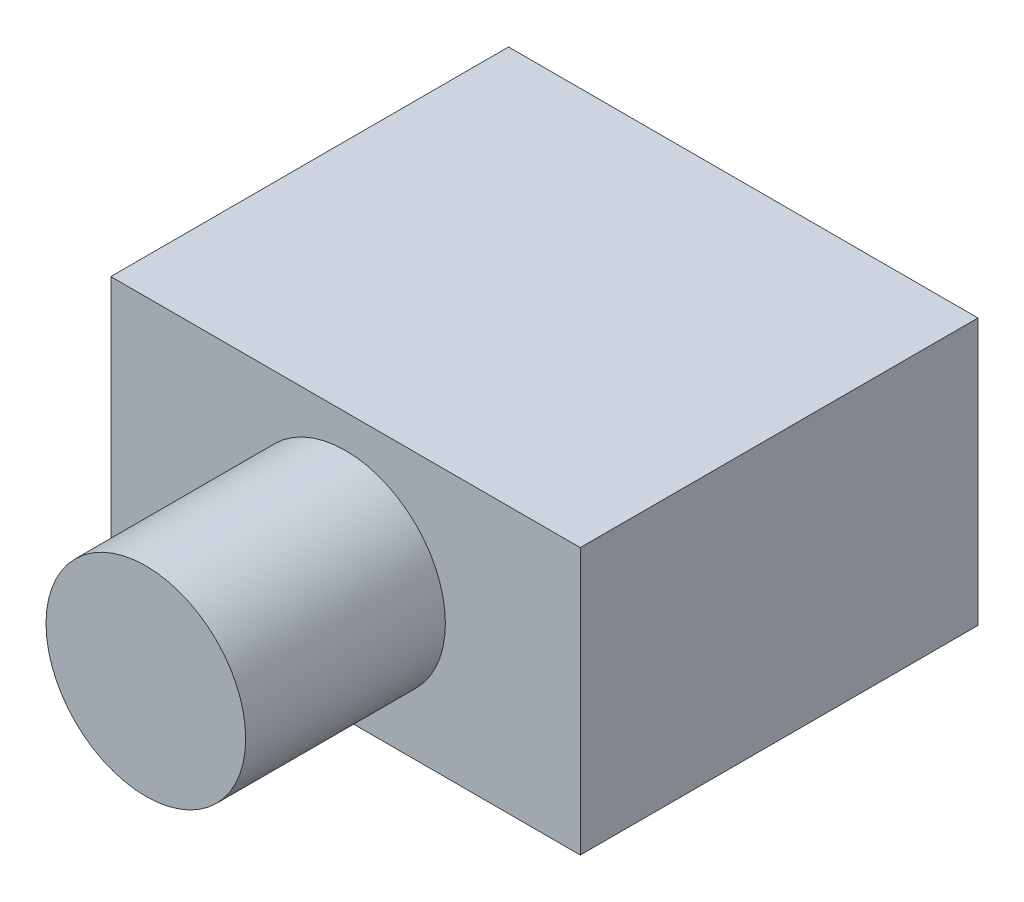
ISO-10303-21;
HEADER;
FILE_DESCRIPTION(('STEP AP214'),'2;1');
FILE_NAME('part.step','',(''),(''),'','','');
FILE_SCHEMA(('AUTOMOTIVE_DESIGN { 1 0 10303 214 1 1 1 1 }'));
ENDSEC;
DATA;
#1=APPLICATION_CONTEXT('core data for automotive mechanical design processes');
#2=APPLICATION_PROTOCOL_DEFINITION('international standard','automotive_design',2000,#1);
#3=PRODUCT_CONTEXT('',#1,'mechanical');
#4=PRODUCT('Part','Part','',(#3));
#5=PRODUCT_RELATED_PRODUCT_CATEGORY('part','',(#4));
#6=PRODUCT_DEFINITION_FORMATION('','',#4);
#7=PRODUCT_DEFINITION_CONTEXT('part definition',#1,'design');
#8=PRODUCT_DEFINITION('design','',#6,#7);
#9=PRODUCT_DEFINITION_SHAPE('','',#8);
#10=(LENGTH_UNIT() NAMED_UNIT(*) SI_UNIT(.MILLI.,.METRE.));
#11=(NAMED_UNIT(*) PLANE_ANGLE_UNIT() SI_UNIT($,.RADIAN.));
#12=(NAMED_UNIT(*) SI_UNIT($,.STERADIAN.) SOLID_ANGLE_UNIT());
#13=UNCERTAINTY_MEASURE_WITH_UNIT(LENGTH_MEASURE(1.E-05),#10,'distance_accuracy_value','');
#14=(GEOMETRIC_REPRESENTATION_CONTEXT(3) GLOBAL_UNCERTAINTY_ASSIGNED_CONTEXT((#13)) GLOBAL_UNIT_ASSIGNED_CONTEXT((#10,
#11,#12)) REPRESENTATION_CONTEXT('',''));
#15=CARTESIAN_POINT('',(0.,0.,0.));
#16=DIRECTION('',(0.,0.,1.));
#17=DIRECTION('',(1.,0.,0.));
#18=AXIS2_PLACEMENT_3D('',#15,#16,#17);
#19=CARTESIAN_POINT('',(14.105,-8.,23.9));
#20=DIRECTION('',(-1.,0.,0.));
#21=DIRECTION('',(0.,0.,1.));
#22=AXIS2_PLACEMENT_3D('',#19,#20,#21);
#23=PLANE('',#22);
#24=DIRECTION('',(0.,1.,0.));
#25=VECTOR('',#24,1.);
#26=CARTESIAN_POINT('',(14.105,-8.,0.));
#27=LINE('',#26,#25);
#28=CARTESIAN_POINT('',(14.105,-8.,0.));
#29=VERTEX_POINT('',#28);
#30=CARTESIAN_POINT('',(14.105,8.,0.));
#31=VERTEX_POINT('',#30);
#32=EDGE_CURVE('E110',#29,#31,#27,.T.);
#33=ORIENTED_EDGE('',*,*,#32,.T.);
#34=DIRECTION('',(0.,0.,-1.));
#35=VECTOR('',#34,1.);
#36=CARTESIAN_POINT('',(14.105,8.,23.9));
#37=LINE('',#36,#35);
#38=CARTESIAN_POINT('',(14.105,8.,23.9));
#39=VERTEX_POINT('',#38);
#40=EDGE_CURVE('E42',#39,#31,#37,.T.);
#41=ORIENTED_EDGE('',*,*,#40,.F.);
#42=DIRECTION('',(0.,1.,0.));
#43=VECTOR('',#42,1.);
#44=CARTESIAN_POINT('',(14.105,-8.,23.9));
#45=LINE('',#44,#43);
#46=CARTESIAN_POINT('',(14.105,-8.,23.9));
#47=VERTEX_POINT('',#46);
#48=EDGE_CURVE('E93',#47,#39,#45,.T.);
#49=ORIENTED_EDGE('',*,*,#48,.F.);
#50=DIRECTION('',(0.,0.,-1.));
#51=VECTOR('',#50,1.);
#52=CARTESIAN_POINT('',(14.105,-8.,23.9));
#53=LINE('',#52,#51);
#54=EDGE_CURVE('E106',#47,#29,#53,.T.);
#55=ORIENTED_EDGE('',*,*,#54,.T.);
#56=EDGE_LOOP('',(#33,#41,#49,#55));
#57=FACE_BOUND('',#56,.T.);
#58=ADVANCED_FACE('F39',(#57),#23,.F.);
#59=CARTESIAN_POINT('',(-14.105,8.,23.9));
#60=DIRECTION('',(0.,-1.,0.));
#61=DIRECTION('',(0.,0.,-1.));
#62=AXIS2_PLACEMENT_3D('',#59,#60,#61);
#63=PLANE('',#62);
#64=DIRECTION('',(-1.,0.,0.));
#65=VECTOR('',#64,1.);
#66=CARTESIAN_POINT('',(-14.105,8.,0.));
#67=LINE('',#66,#65);
#68=CARTESIAN_POINT('',(-14.105,8.,0.));
#69=VERTEX_POINT('',#68);
#70=EDGE_CURVE('E99',#31,#69,#67,.T.);
#71=ORIENTED_EDGE('',*,*,#70,.T.);
#72=DIRECTION('',(0.,0.,-1.));
#73=VECTOR('',#72,1.);
#74=CARTESIAN_POINT('',(-14.105,8.,23.9));
#75=LINE('',#74,#73);
#76=CARTESIAN_POINT('',(-14.105,8.,23.9));
#77=VERTEX_POINT('',#76);
#78=EDGE_CURVE('E97',#77,#69,#75,.T.);
#79=ORIENTED_EDGE('',*,*,#78,.F.);
#80=DIRECTION('',(-1.,0.,0.));
#81=VECTOR('',#80,1.);
#82=CARTESIAN_POINT('',(-14.105,8.,23.9));
#83=LINE('',#82,#81);
#84=EDGE_CURVE('E88',#39,#77,#83,.T.);
#85=ORIENTED_EDGE('',*,*,#84,.F.);
#86=ORIENTED_EDGE('',*,*,#40,.T.);
#87=EDGE_LOOP('',(#71,#79,#85,#86));
#88=FACE_BOUND('',#87,.T.);
#89=ADVANCED_FACE('F98',(#88),#63,.F.);
#90=CARTESIAN_POINT('',(-14.105,-8.,23.9));
#91=DIRECTION('',(1.,0.,0.));
#92=DIRECTION('',(0.,0.,-1.));
#93=AXIS2_PLACEMENT_3D('',#90,#91,#92);
#94=PLANE('',#93);
#95=DIRECTION('',(0.,-1.,0.));
#96=VECTOR('',#95,1.);
#97=CARTESIAN_POINT('',(-14.105,-8.,0.));
#98=LINE('',#97,#96);
#99=CARTESIAN_POINT('',(-14.105,-8.,0.));
#100=VERTEX_POINT('',#99);
#101=EDGE_CURVE('E74',#69,#100,#98,.T.);
#102=ORIENTED_EDGE('',*,*,#101,.T.);
#103=DIRECTION('',(0.,0.,-1.));
#104=VECTOR('',#103,1.);
#105=CARTESIAN_POINT('',(-14.105,-8.,23.9));
#106=LINE('',#105,#104);
#107=CARTESIAN_POINT('',(-14.105,-8.,23.9));
#108=VERTEX_POINT('',#107);
#109=EDGE_CURVE('E101',#108,#100,#106,.T.);
#110=ORIENTED_EDGE('',*,*,#109,.F.);
#111=DIRECTION('',(0.,-1.,0.));
#112=VECTOR('',#111,1.);
#113=CARTESIAN_POINT('',(-14.105,-8.,23.9));
#114=LINE('',#113,#112);
#115=EDGE_CURVE('E91',#77,#108,#114,.T.);
#116=ORIENTED_EDGE('',*,*,#115,.F.);
#117=ORIENTED_EDGE('',*,*,#78,.T.);
#118=EDGE_LOOP('',(#102,#110,#116,#117));
#119=FACE_BOUND('',#118,.T.);
#120=ADVANCED_FACE('F102',(#119),#94,.F.);
#121=CARTESIAN_POINT('',(-14.105,-8.,23.9));
#122=DIRECTION('',(0.,1.,0.));
#123=DIRECTION('',(0.,0.,1.));
#124=AXIS2_PLACEMENT_3D('',#121,#122,#123);
#125=PLANE('',#124);
#126=DIRECTION('',(1.,0.,0.));
#127=VECTOR('',#126,1.);
#128=CARTESIAN_POINT('',(-14.105,-8.,0.));
#129=LINE('',#128,#127);
#130=EDGE_CURVE('E80',#100,#29,#129,.T.);
#131=ORIENTED_EDGE('',*,*,#130,.T.);
#132=ORIENTED_EDGE('',*,*,#54,.F.);
#133=DIRECTION('',(1.,0.,0.));
#134=VECTOR('',#133,1.);
#135=CARTESIAN_POINT('',(-14.105,-8.,23.9));
#136=LINE('',#135,#134);
#137=EDGE_CURVE('E57',#108,#47,#136,.T.);
#138=ORIENTED_EDGE('',*,*,#137,.F.);
#139=ORIENTED_EDGE('',*,*,#109,.T.);
#140=EDGE_LOOP('',(#131,#132,#138,#139));
#141=FACE_BOUND('',#140,.T.);
#142=ADVANCED_FACE('F124',(#141),#125,.F.);
#143=CARTESIAN_POINT('',(0.,0.,23.9));
#144=DIRECTION('',(0.,0.,-1.));
#145=DIRECTION('',(-1.,0.,0.));
#146=AXIS2_PLACEMENT_3D('',#143,#144,#145);
#147=PLANE('',#146);
#148=CARTESIAN_POINT('',(0.,0.,23.9));
#149=DIRECTION('',(0.,0.,1.));
#150=DIRECTION('',(1.,0.,0.));
#151=AXIS2_PLACEMENT_3D('',#148,#149,#150);
#152=CIRCLE('',#151,6.);
#153=CARTESIAN_POINT('',(6.,0.,23.9));
#154=VERTEX_POINT('',#153);
#155=EDGE_CURVE('E11',#154,#154,#152,.T.);
#156=ORIENTED_EDGE('',*,*,#155,.F.);
#157=EDGE_LOOP('',(#156));
#158=FACE_BOUND('',#157,.T.);
#159=ORIENTED_EDGE('',*,*,#48,.T.);
#160=ORIENTED_EDGE('',*,*,#84,.T.);
#161=ORIENTED_EDGE('',*,*,#115,.T.);
#162=ORIENTED_EDGE('',*,*,#137,.T.);
#163=EDGE_LOOP('',(#159,#160,#161,#162));
#164=FACE_BOUND('',#163,.T.);
#165=ADVANCED_FACE('F89',(#158,#164),#147,.F.);
#166=CARTESIAN_POINT('',(0.,0.,0.));
#167=DIRECTION('',(0.,0.,-1.));
#168=DIRECTION('',(-1.,0.,0.));
#169=AXIS2_PLACEMENT_3D('',#166,#167,#168);
#170=PLANE('',#169);
#171=ORIENTED_EDGE('',*,*,#32,.F.);
#172=ORIENTED_EDGE('',*,*,#130,.F.);
#173=ORIENTED_EDGE('',*,*,#101,.F.);
#174=ORIENTED_EDGE('',*,*,#70,.F.);
#175=EDGE_LOOP('',(#171,#172,#173,#174));
#176=FACE_BOUND('',#175,.T.);
#177=ADVANCED_FACE('F127',(#176),#170,.T.);
#178=CARTESIAN_POINT('',(0.,0.,35.9));
#179=DIRECTION('',(0.,0.,-1.));
#180=DIRECTION('',(-1.,0.,0.));
#181=AXIS2_PLACEMENT_3D('',#178,#179,#180);
#182=CYLINDRICAL_SURFACE('',#181,6.);
#183=CARTESIAN_POINT('',(0.,0.,35.9));
#184=DIRECTION('',(0.,0.,1.));
#185=DIRECTION('',(1.,0.,0.));
#186=AXIS2_PLACEMENT_3D('',#183,#184,#185);
#187=CIRCLE('',#186,6.);
#188=CARTESIAN_POINT('',(6.,0.,35.9));
#189=VERTEX_POINT('',#188);
#190=EDGE_CURVE('E114',#189,#189,#187,.T.);
#191=ORIENTED_EDGE('',*,*,#190,.F.);
#192=EDGE_LOOP('',(#191));
#193=FACE_BOUND('',#192,.T.);
#194=ORIENTED_EDGE('',*,*,#155,.T.);
#195=EDGE_LOOP('',(#194));
#196=FACE_BOUND('',#195,.T.);
#197=ADVANCED_FACE('F137',(#193,#196),#182,.T.);
#198=CARTESIAN_POINT('',(0.,0.,35.9));
#199=DIRECTION('',(0.,0.,1.));
#200=DIRECTION('',(1.,0.,0.));
#201=AXIS2_PLACEMENT_3D('',#198,#199,#200);
#202=PLANE('',#201);
#203=ORIENTED_EDGE('',*,*,#190,.T.);
#204=EDGE_LOOP('',(#203));
#205=FACE_BOUND('',#204,.T.);
#206=ADVANCED_FACE('F135',(#205),#202,.T.);
#207=CLOSED_SHELL('',(#58,#89,#120,#142,#165,#177,#197,#206));
#208=MANIFOLD_SOLID_BREP('B2',#207);
#209=ADVANCED_BREP_SHAPE_REPRESENTATION('',(#18,#208),#14);
#210=SHAPE_DEFINITION_REPRESENTATION(#9,#209);
ENDSEC;
END-ISO-10303-21;
